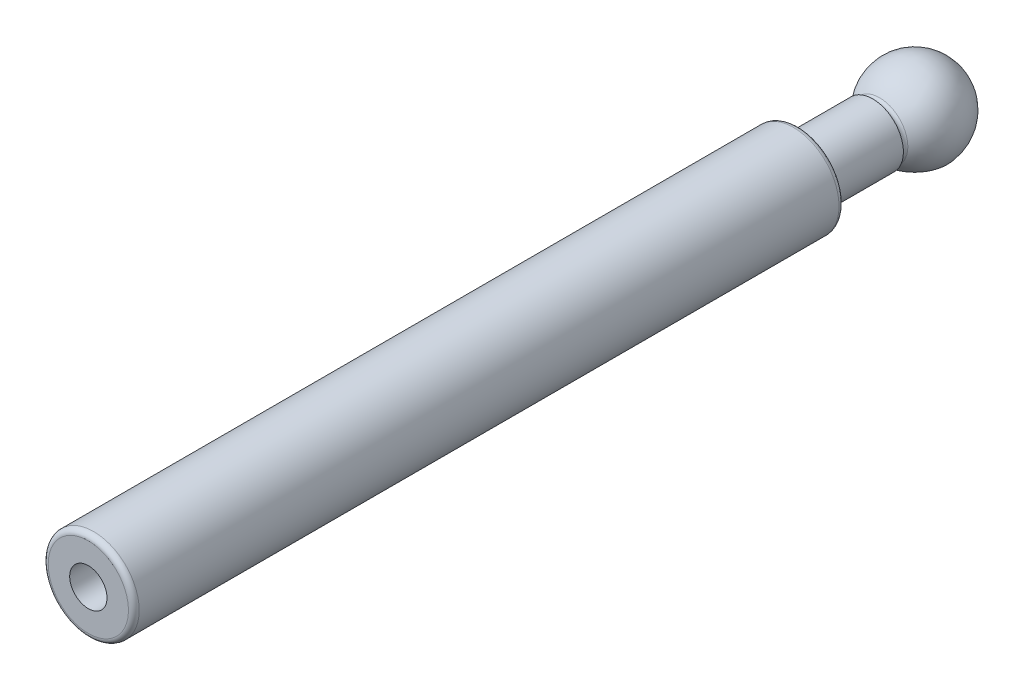
ISO-10303-21;
HEADER;
FILE_DESCRIPTION(('STEP AP214'),'2;1');
FILE_NAME('part.step','',(''),(''),'','','');
FILE_SCHEMA(('AUTOMOTIVE_DESIGN { 1 0 10303 214 1 1 1 1 }'));
ENDSEC;
DATA;
#1=APPLICATION_CONTEXT('core data for automotive mechanical design processes');
#2=APPLICATION_PROTOCOL_DEFINITION('international standard','automotive_design',2000,#1);
#3=PRODUCT_CONTEXT('',#1,'mechanical');
#4=PRODUCT('Part','Part','',(#3));
#5=PRODUCT_RELATED_PRODUCT_CATEGORY('part','',(#4));
#6=PRODUCT_DEFINITION_FORMATION('','',#4);
#7=PRODUCT_DEFINITION_CONTEXT('part definition',#1,'design');
#8=PRODUCT_DEFINITION('design','',#6,#7);
#9=PRODUCT_DEFINITION_SHAPE('','',#8);
#10=(LENGTH_UNIT() NAMED_UNIT(*) SI_UNIT(.MILLI.,.METRE.));
#11=(NAMED_UNIT(*) PLANE_ANGLE_UNIT() SI_UNIT($,.RADIAN.));
#12=(NAMED_UNIT(*) SI_UNIT($,.STERADIAN.) SOLID_ANGLE_UNIT());
#13=UNCERTAINTY_MEASURE_WITH_UNIT(LENGTH_MEASURE(1.E-05),#10,'distance_accuracy_value','');
#14=(GEOMETRIC_REPRESENTATION_CONTEXT(3) GLOBAL_UNCERTAINTY_ASSIGNED_CONTEXT((#13)) GLOBAL_UNIT_ASSIGNED_CONTEXT((#10,
#11,#12)) REPRESENTATION_CONTEXT('',''));
#15=CARTESIAN_POINT('',(0.,0.,0.));
#16=DIRECTION('',(0.,0.,1.));
#17=DIRECTION('',(1.,0.,0.));
#18=AXIS2_PLACEMENT_3D('',#15,#16,#17);
#19=CARTESIAN_POINT('',(0.,3.071,13.589));
#20=DIRECTION('',(0.,0.,-1.));
#21=DIRECTION('',(-1.,0.,0.));
#22=AXIS2_PLACEMENT_3D('',#19,#20,#21);
#23=PLANE('',#22);
#24=CARTESIAN_POINT('',(0.,0.,13.589));
#25=DIRECTION('',(0.,0.,-1.));
#26=DIRECTION('',(-1.,0.,0.));
#27=AXIS2_PLACEMENT_3D('',#24,#25,#26);
#28=CIRCLE('',#27,6.60860000000001);
#29=CARTESIAN_POINT('',(-6.60860000000001,0.,13.589));
#30=VERTEX_POINT('',#29);
#31=EDGE_CURVE('E10',#30,#30,#28,.F.);
#32=ORIENTED_EDGE('',*,*,#31,.T.);
#33=EDGE_LOOP('',(#32));
#34=FACE_BOUND('',#33,.T.);
#35=CARTESIAN_POINT('',(0.,0.,13.589));
#36=DIRECTION('',(0.,0.,1.));
#37=DIRECTION('',(1.,0.,0.));
#38=AXIS2_PLACEMENT_3D('',#35,#36,#37);
#39=CIRCLE('',#38,3.07100000000001);
#40=CARTESIAN_POINT('',(3.07100000000001,0.,13.589));
#41=VERTEX_POINT('',#40);
#42=EDGE_CURVE('E57',#41,#41,#39,.T.);
#43=ORIENTED_EDGE('',*,*,#42,.F.);
#44=EDGE_LOOP('',(#43));
#45=FACE_BOUND('',#44,.T.);
#46=ADVANCED_FACE('F34',(#34,#45),#23,.F.);
#47=CARTESIAN_POINT('',(0.,0.,122.555));
#48=DIRECTION('',(0.,0.,1.));
#49=DIRECTION('',(1.,0.,0.));
#50=AXIS2_PLACEMENT_3D('',#47,#48,#49);
#51=CYLINDRICAL_SURFACE('',#50,7.49300000000001);
#52=CARTESIAN_POINT('',(0.,0.,-102.6206));
#53=DIRECTION('',(0.,0.,1.));
#54=DIRECTION('',(1.,0.,0.));
#55=AXIS2_PLACEMENT_3D('',#52,#53,#54);
#56=CIRCLE('',#55,7.49300000000001);
#57=CARTESIAN_POINT('',(7.49300000000001,0.,-102.6206));
#58=VERTEX_POINT('',#57);
#59=EDGE_CURVE('E45',#58,#58,#56,.T.);
#60=ORIENTED_EDGE('',*,*,#59,.T.);
#61=EDGE_LOOP('',(#60));
#62=FACE_BOUND('',#61,.T.);
#63=CARTESIAN_POINT('',(0.,0.,12.7046));
#64=DIRECTION('',(0.,0.,-1.));
#65=DIRECTION('',(-1.,0.,0.));
#66=AXIS2_PLACEMENT_3D('',#63,#64,#65);
#67=CIRCLE('',#66,7.49300000000001);
#68=CARTESIAN_POINT('',(-7.49300000000001,0.,12.7046));
#69=VERTEX_POINT('',#68);
#70=EDGE_CURVE('E49',#69,#69,#67,.T.);
#71=ORIENTED_EDGE('',*,*,#70,.T.);
#72=EDGE_LOOP('',(#71));
#73=FACE_BOUND('',#72,.T.);
#74=ADVANCED_FACE('F110',(#62,#73),#51,.T.);
#75=CARTESIAN_POINT('',(0.,0.,-103.505));
#76=DIRECTION('',(0.,0.,1.));
#77=DIRECTION('',(1.,0.,0.));
#78=AXIS2_PLACEMENT_3D('',#75,#76,#77);
#79=PLANE('',#78);
#80=CARTESIAN_POINT('',(0.,0.,-103.505));
#81=DIRECTION('',(0.,0.,-1.));
#82=DIRECTION('',(0.,1.,0.));
#83=AXIS2_PLACEMENT_3D('',#80,#81,#82);
#84=CIRCLE('',#83,5.05);
#85=CARTESIAN_POINT('',(0.,5.05,-103.505));
#86=VERTEX_POINT('',#85);
#87=EDGE_CURVE('E60',#86,#86,#84,.T.);
#88=ORIENTED_EDGE('',*,*,#87,.F.);
#89=EDGE_LOOP('',(#88));
#90=FACE_BOUND('',#89,.T.);
#91=CARTESIAN_POINT('',(0.,0.,-103.505));
#92=DIRECTION('',(0.,0.,1.));
#93=DIRECTION('',(1.,0.,0.));
#94=AXIS2_PLACEMENT_3D('',#91,#92,#93);
#95=CIRCLE('',#94,6.60860000000001);
#96=CARTESIAN_POINT('',(6.60860000000001,0.,-103.505));
#97=VERTEX_POINT('',#96);
#98=EDGE_CURVE('E41',#97,#97,#95,.F.);
#99=ORIENTED_EDGE('',*,*,#98,.T.);
#100=EDGE_LOOP('',(#99));
#101=FACE_BOUND('',#100,.T.);
#102=ADVANCED_FACE('F115',(#90,#101),#79,.F.);
#103=CARTESIAN_POINT('',(0.,3.071,-96.327));
#104=DIRECTION('',(0.,0.,-1.));
#105=DIRECTION('',(-1.,0.,0.));
#106=AXIS2_PLACEMENT_3D('',#103,#104,#105);
#107=PLANE('',#106);
#108=CARTESIAN_POINT('',(0.,0.,-96.327));
#109=DIRECTION('',(0.,0.,1.));
#110=DIRECTION('',(1.,0.,0.));
#111=AXIS2_PLACEMENT_3D('',#108,#109,#110);
#112=CIRCLE('',#111,3.07100000000001);
#113=CARTESIAN_POINT('',(3.07100000000001,0.,-96.327));
#114=VERTEX_POINT('',#113);
#115=EDGE_CURVE('E54',#114,#114,#112,.T.);
#116=ORIENTED_EDGE('',*,*,#115,.T.);
#117=EDGE_LOOP('',(#116));
#118=FACE_BOUND('',#117,.T.);
#119=ADVANCED_FACE('F129',(#118),#107,.F.);
#120=CARTESIAN_POINT('',(0.,0.,122.555));
#121=DIRECTION('',(0.,0.,1.));
#122=DIRECTION('',(1.,0.,0.));
#123=AXIS2_PLACEMENT_3D('',#120,#121,#122);
#124=CYLINDRICAL_SURFACE('',#123,3.07100000000001);
#125=ORIENTED_EDGE('',*,*,#115,.F.);
#126=EDGE_LOOP('',(#125));
#127=FACE_BOUND('',#126,.T.);
#128=ORIENTED_EDGE('',*,*,#42,.T.);
#129=EDGE_LOOP('',(#128));
#130=FACE_BOUND('',#129,.T.);
#131=ADVANCED_FACE('F122',(#127,#130),#124,.F.);
#132=CARTESIAN_POINT('',(0.,0.,-102.6206));
#133=DIRECTION('',(0.,0.,1.));
#134=DIRECTION('',(1.,0.,0.));
#135=AXIS2_PLACEMENT_3D('',#132,#133,#134);
#136=TOROIDAL_SURFACE('',#135,6.60860000000001,0.8844);
#137=ORIENTED_EDGE('',*,*,#98,.F.);
#138=EDGE_LOOP('',(#137));
#139=FACE_BOUND('',#138,.T.);
#140=ORIENTED_EDGE('',*,*,#59,.F.);
#141=EDGE_LOOP('',(#140));
#142=FACE_BOUND('',#141,.T.);
#143=ADVANCED_FACE('F120',(#139,#142),#136,.T.);
#144=CARTESIAN_POINT('',(0.,0.,12.7046));
#145=DIRECTION('',(0.,0.,-1.));
#146=DIRECTION('',(-1.,0.,0.));
#147=AXIS2_PLACEMENT_3D('',#144,#145,#146);
#148=TOROIDAL_SURFACE('',#147,6.60860000000001,0.8844);
#149=ORIENTED_EDGE('',*,*,#70,.F.);
#150=EDGE_LOOP('',(#149));
#151=FACE_BOUND('',#150,.T.);
#152=ORIENTED_EDGE('',*,*,#31,.F.);
#153=EDGE_LOOP('',(#152));
#154=FACE_BOUND('',#153,.T.);
#155=ADVANCED_FACE('F36',(#151,#154),#148,.T.);
#156=CARTESIAN_POINT('',(0.,0.,-122.555));
#157=DIRECTION('',(0.,0.,-1.));
#158=DIRECTION('',(0.,1.,0.));
#159=AXIS2_PLACEMENT_3D('',#156,#157,#158);
#160=SPHERICAL_SURFACE('',#159,5.);
#161=CARTESIAN_POINT('',(0.,0.,-122.555));
#162=DIRECTION('',(0.,-1.,0.));
#163=DIRECTION('',(0.,0.,-1.));
#164=AXIS2_PLACEMENT_3D('',#161,#162,#163);
#165=SPHERICAL_SURFACE('',#164,5.);
#166=CARTESIAN_POINT('',(0.,0.,-122.555));
#167=DIRECTION('',(0.,-1.,0.));
#168=DIRECTION('',(0.,0.,-1.));
#169=AXIS2_PLACEMENT_3D('',#166,#167,#168);
#170=CIRCLE('',#169,5.00000000000003);
#171=CARTESIAN_POINT('',(0.,0.,-127.555));
#172=VERTEX_POINT('',#171);
#173=EDGE_CURVE('E75',#172,#172,#170,.T.);
#174=ORIENTED_EDGE('',*,*,#173,.T.);
#175=EDGE_LOOP('',(#174));
#176=FACE_BOUND('',#175,.T.);
#177=ADVANCED_FACE('F79',(#176),#165,.F.);
#178=CARTESIAN_POINT('',(0.,-5.05,-127.555));
#179=DIRECTION('',(0.,1.,0.));
#180=DIRECTION('',(0.,0.,1.));
#181=AXIS2_PLACEMENT_3D('',#178,#179,#180);
#182=PLANE('',#181);
#183=CARTESIAN_POINT('',(0.,-5.05,-122.555));
#184=DIRECTION('',(0.,-1.,0.));
#185=DIRECTION('',(0.,0.,-1.));
#186=AXIS2_PLACEMENT_3D('',#183,#184,#185);
#187=CIRCLE('',#186,5.00000000000003);
#188=CARTESIAN_POINT('',(0.,-5.05,-127.555));
#189=VERTEX_POINT('',#188);
#190=EDGE_CURVE('E72',#189,#189,#187,.T.);
#191=ORIENTED_EDGE('',*,*,#190,.F.);
#192=EDGE_LOOP('',(#191));
#193=FACE_BOUND('',#192,.T.);
#194=CARTESIAN_POINT('',(0.,-5.05,-122.555));
#195=DIRECTION('',(0.,-1.,0.));
#196=DIRECTION('',(0.,0.,-1.));
#197=AXIS2_PLACEMENT_3D('',#194,#195,#196);
#198=CIRCLE('',#197,5.40902024399986);
#199=CARTESIAN_POINT('',(0.,-5.05,-127.964020244));
#200=VERTEX_POINT('',#199);
#201=EDGE_CURVE('E69',#200,#200,#198,.T.);
#202=ORIENTED_EDGE('',*,*,#201,.T.);
#203=EDGE_LOOP('',(#202));
#204=FACE_BOUND('',#203,.T.);
#205=ADVANCED_FACE('F85',(#193,#204),#182,.F.);
#206=CARTESIAN_POINT('',(0.,0.,-122.555));
#207=DIRECTION('',(0.,-1.,0.));
#208=DIRECTION('',(0.,0.,-1.));
#209=AXIS2_PLACEMENT_3D('',#206,#207,#208);
#210=CYLINDRICAL_SURFACE('',#209,5.00000000000003);
#211=ORIENTED_EDGE('',*,*,#173,.F.);
#212=EDGE_LOOP('',(#211));
#213=FACE_BOUND('',#212,.T.);
#214=ORIENTED_EDGE('',*,*,#190,.T.);
#215=EDGE_LOOP('',(#214));
#216=FACE_BOUND('',#215,.T.);
#217=ADVANCED_FACE('F81',(#213,#216),#210,.F.);
#218=CARTESIAN_POINT('',(0.,0.,-103.505));
#219=DIRECTION('',(0.,0.,-1.));
#220=DIRECTION('',(0.,1.,0.));
#221=AXIS2_PLACEMENT_3D('',#218,#219,#220);
#222=CYLINDRICAL_SURFACE('',#221,5.05);
#223=ORIENTED_EDGE('',*,*,#87,.T.);
#224=EDGE_LOOP('',(#223));
#225=FACE_BOUND('',#224,.T.);
#226=CARTESIAN_POINT('',(0.,0.,-115.670302007297));
#227=DIRECTION('',(0.,0.,-1.));
#228=DIRECTION('',(0.,1.,0.));
#229=AXIS2_PLACEMENT_3D('',#226,#227,#228);
#230=CIRCLE('',#229,5.05);
#231=CARTESIAN_POINT('',(0.,5.05,-115.670302007297));
#232=VERTEX_POINT('',#231);
#233=EDGE_CURVE('E63',#232,#232,#230,.T.);
#234=ORIENTED_EDGE('',*,*,#233,.F.);
#235=EDGE_LOOP('',(#234));
#236=FACE_BOUND('',#235,.T.);
#237=ADVANCED_FACE('F84',(#225,#236),#222,.T.);
#238=CARTESIAN_POINT('',(0.,0.,-116.305302007297));
#239=DIRECTION('',(0.,0.,-1.));
#240=DIRECTION('',(0.,1.,0.));
#241=AXIS2_PLACEMENT_3D('',#238,#239,#240);
#242=TOROIDAL_SURFACE('',#241,5.05,0.635000000000001);
#243=ORIENTED_EDGE('',*,*,#233,.T.);
#244=EDGE_LOOP('',(#243));
#245=FACE_BOUND('',#244,.T.);
#246=CARTESIAN_POINT('',(0.,0.,-116.799210933914));
#247=DIRECTION('',(0.,0.,-1.));
#248=DIRECTION('',(0.,1.,0.));
#249=AXIS2_PLACEMENT_3D('',#246,#247,#248);
#250=CIRCLE('',#249,4.65090230242688);
#251=CARTESIAN_POINT('',(0.,4.65090230242689,-116.799210933914));
#252=VERTEX_POINT('',#251);
#253=EDGE_CURVE('E66',#252,#252,#250,.T.);
#254=ORIENTED_EDGE('',*,*,#253,.F.);
#255=EDGE_LOOP('',(#254));
#256=FACE_BOUND('',#255,.T.);
#257=ADVANCED_FACE('F97',(#245,#256),#242,.F.);
#258=CARTESIAN_POINT('',(0.,0.,-122.555));
#259=DIRECTION('',(0.,0.,-1.));
#260=DIRECTION('',(0.,1.,0.));
#261=AXIS2_PLACEMENT_3D('',#258,#259,#260);
#262=SPHERICAL_SURFACE('',#261,7.40000000000003);
#263=ORIENTED_EDGE('',*,*,#201,.F.);
#264=EDGE_LOOP('',(#263));
#265=FACE_BOUND('',#264,.T.);
#266=ORIENTED_EDGE('',*,*,#253,.T.);
#267=EDGE_LOOP('',(#266));
#268=FACE_BOUND('',#267,.T.);
#269=ADVANCED_FACE('F94',(#265,#268),#262,.T.);
#270=CLOSED_SHELL('',(#46,#74,#102,#119,#131,#143,#155,#177,#205,#217,#237,#257,#269));
#271=MANIFOLD_SOLID_BREP('B2',#270);
#272=ADVANCED_BREP_SHAPE_REPRESENTATION('',(#18,#271),#14);
#273=SHAPE_DEFINITION_REPRESENTATION(#9,#272);
ENDSEC;
END-ISO-10303-21;
